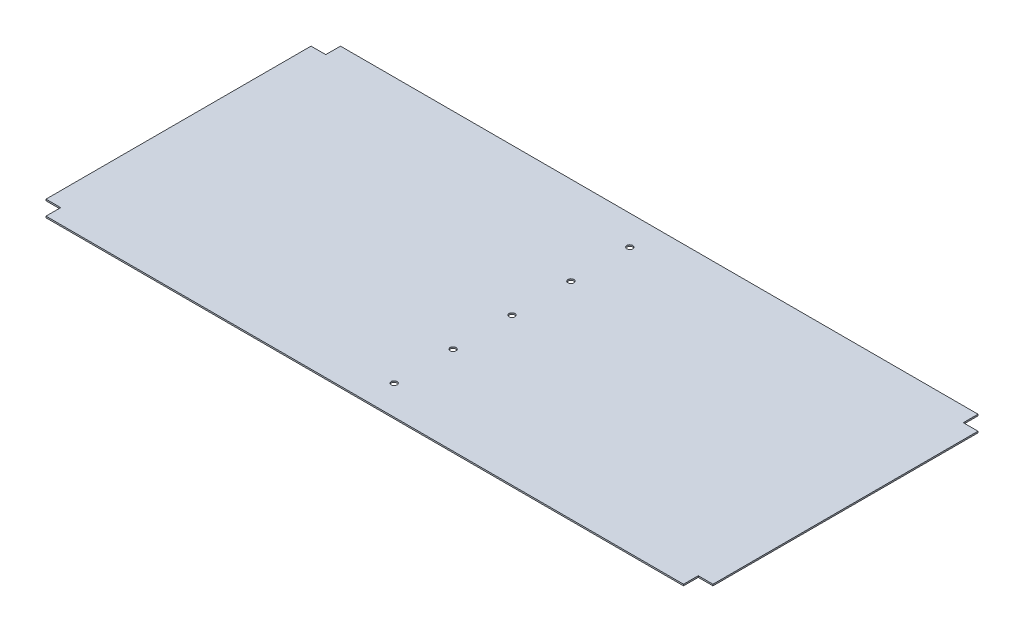
ISO-10303-21;
HEADER;
FILE_DESCRIPTION(('STEP AP214'),'2;1');
FILE_NAME('part.step','',(''),(''),'','','');
FILE_SCHEMA(('AUTOMOTIVE_DESIGN { 1 0 10303 214 1 1 1 1 }'));
ENDSEC;
DATA;
#1=APPLICATION_CONTEXT('core data for automotive mechanical design processes');
#2=APPLICATION_PROTOCOL_DEFINITION('international standard','automotive_design',2000,#1);
#3=PRODUCT_CONTEXT('',#1,'mechanical');
#4=PRODUCT('Part','Part','',(#3));
#5=PRODUCT_RELATED_PRODUCT_CATEGORY('part','',(#4));
#6=PRODUCT_DEFINITION_FORMATION('','',#4);
#7=PRODUCT_DEFINITION_CONTEXT('part definition',#1,'design');
#8=PRODUCT_DEFINITION('design','',#6,#7);
#9=PRODUCT_DEFINITION_SHAPE('','',#8);
#10=(LENGTH_UNIT() NAMED_UNIT(*) SI_UNIT(.MILLI.,.METRE.));
#11=(NAMED_UNIT(*) PLANE_ANGLE_UNIT() SI_UNIT($,.RADIAN.));
#12=(NAMED_UNIT(*) SI_UNIT($,.STERADIAN.) SOLID_ANGLE_UNIT());
#13=UNCERTAINTY_MEASURE_WITH_UNIT(LENGTH_MEASURE(1.E-05),#10,'distance_accuracy_value','');
#14=(GEOMETRIC_REPRESENTATION_CONTEXT(3) GLOBAL_UNCERTAINTY_ASSIGNED_CONTEXT((#13)) GLOBAL_UNIT_ASSIGNED_CONTEXT((#10,
#11,#12)) REPRESENTATION_CONTEXT('',''));
#15=CARTESIAN_POINT('',(0.,0.,0.));
#16=DIRECTION('',(0.,0.,1.));
#17=DIRECTION('',(1.,0.,0.));
#18=AXIS2_PLACEMENT_3D('',#15,#16,#17);
#19=CARTESIAN_POINT('',(-453.,-2.,0.));
#20=DIRECTION('',(-1.,0.,0.));
#21=DIRECTION('',(0.,0.,1.));
#22=AXIS2_PLACEMENT_3D('',#19,#20,#21);
#23=PLANE('',#22);
#24=DIRECTION('',(0.,1.,0.));
#25=VECTOR('',#24,1.);
#26=CARTESIAN_POINT('',(-453.,-10.,-20.));
#27=LINE('',#26,#25);
#28=CARTESIAN_POINT('',(-453.,-2.,-20.));
#29=VERTEX_POINT('',#28);
#30=CARTESIAN_POINT('',(-453.,0.,-20.));
#31=VERTEX_POINT('',#30);
#32=EDGE_CURVE('E139',#29,#31,#27,.T.);
#33=ORIENTED_EDGE('',*,*,#32,.T.);
#34=DIRECTION('',(0.,0.,1.));
#35=VECTOR('',#34,1.);
#36=CARTESIAN_POINT('',(-453.,0.,0.));
#37=LINE('',#36,#35);
#38=CARTESIAN_POINT('',(-453.,0.,-380.));
#39=VERTEX_POINT('',#38);
#40=EDGE_CURVE('E156',#39,#31,#37,.T.);
#41=ORIENTED_EDGE('',*,*,#40,.F.);
#42=DIRECTION('',(0.,1.,0.));
#43=VECTOR('',#42,1.);
#44=CARTESIAN_POINT('',(-453.,-10.,-380.));
#45=LINE('',#44,#43);
#46=CARTESIAN_POINT('',(-453.,-2.,-380.));
#47=VERTEX_POINT('',#46);
#48=EDGE_CURVE('E187',#47,#39,#45,.T.);
#49=ORIENTED_EDGE('',*,*,#48,.F.);
#50=DIRECTION('',(0.,0.,1.));
#51=VECTOR('',#50,1.);
#52=CARTESIAN_POINT('',(-453.,-2.,0.));
#53=LINE('',#52,#51);
#54=EDGE_CURVE('E209',#47,#29,#53,.T.);
#55=ORIENTED_EDGE('',*,*,#54,.T.);
#56=EDGE_LOOP('',(#33,#41,#49,#55));
#57=FACE_BOUND('',#56,.T.);
#58=ADVANCED_FACE('F38',(#57),#23,.T.);
#59=CARTESIAN_POINT('',(-453.,-2.,-400.));
#60=DIRECTION('',(0.,0.,-1.));
#61=DIRECTION('',(-1.,0.,0.));
#62=AXIS2_PLACEMENT_3D('',#59,#60,#61);
#63=PLANE('',#62);
#64=DIRECTION('',(0.,1.,0.));
#65=VECTOR('',#64,1.);
#66=CARTESIAN_POINT('',(433.,-10.,-400.));
#67=LINE('',#66,#65);
#68=CARTESIAN_POINT('',(433.,-2.,-400.));
#69=VERTEX_POINT('',#68);
#70=CARTESIAN_POINT('',(433.,0.,-400.));
#71=VERTEX_POINT('',#70);
#72=EDGE_CURVE('E54',#69,#71,#67,.T.);
#73=ORIENTED_EDGE('',*,*,#72,.F.);
#74=DIRECTION('',(-1.,0.,0.));
#75=VECTOR('',#74,1.);
#76=CARTESIAN_POINT('',(-453.,-2.,-400.));
#77=LINE('',#76,#75);
#78=CARTESIAN_POINT('',(-433.,-2.,-400.));
#79=VERTEX_POINT('',#78);
#80=EDGE_CURVE('E11',#69,#79,#77,.T.);
#81=ORIENTED_EDGE('',*,*,#80,.T.);
#82=DIRECTION('',(0.,1.,0.));
#83=VECTOR('',#82,1.);
#84=CARTESIAN_POINT('',(-433.,-10.,-400.));
#85=LINE('',#84,#83);
#86=CARTESIAN_POINT('',(-433.,0.,-400.));
#87=VERTEX_POINT('',#86);
#88=EDGE_CURVE('E188',#79,#87,#85,.T.);
#89=ORIENTED_EDGE('',*,*,#88,.T.);
#90=DIRECTION('',(-1.,0.,0.));
#91=VECTOR('',#90,1.);
#92=CARTESIAN_POINT('',(-453.,0.,-400.));
#93=LINE('',#92,#91);
#94=EDGE_CURVE('E41',#71,#87,#93,.T.);
#95=ORIENTED_EDGE('',*,*,#94,.F.);
#96=EDGE_LOOP('',(#73,#81,#89,#95));
#97=FACE_BOUND('',#96,.T.);
#98=ADVANCED_FACE('F226',(#97),#63,.T.);
#99=CARTESIAN_POINT('',(453.,-2.,-1.72915724161782E-13));
#100=DIRECTION('',(1.,0.,0.));
#101=DIRECTION('',(0.,0.,-1.));
#102=AXIS2_PLACEMENT_3D('',#99,#100,#101);
#103=PLANE('',#102);
#104=DIRECTION('',(0.,1.,0.));
#105=VECTOR('',#104,1.);
#106=CARTESIAN_POINT('',(453.,-10.,-380.));
#107=LINE('',#106,#105);
#108=CARTESIAN_POINT('',(453.,-2.,-380.));
#109=VERTEX_POINT('',#108);
#110=CARTESIAN_POINT('',(453.,0.,-380.));
#111=VERTEX_POINT('',#110);
#112=EDGE_CURVE('E166',#109,#111,#107,.T.);
#113=ORIENTED_EDGE('',*,*,#112,.T.);
#114=DIRECTION('',(0.,0.,-1.));
#115=VECTOR('',#114,1.);
#116=CARTESIAN_POINT('',(453.,0.,-1.72915724161782E-13));
#117=LINE('',#116,#115);
#118=CARTESIAN_POINT('',(453.,0.,-19.9999999999999));
#119=VERTEX_POINT('',#118);
#120=EDGE_CURVE('E219',#119,#111,#117,.T.);
#121=ORIENTED_EDGE('',*,*,#120,.F.);
#122=DIRECTION('',(0.,1.,0.));
#123=VECTOR('',#122,1.);
#124=CARTESIAN_POINT('',(453.,-10.,-19.9999999999999));
#125=LINE('',#124,#123);
#126=CARTESIAN_POINT('',(453.,-2.,-19.9999999999999));
#127=VERTEX_POINT('',#126);
#128=EDGE_CURVE('E62',#127,#119,#125,.T.);
#129=ORIENTED_EDGE('',*,*,#128,.F.);
#130=DIRECTION('',(0.,0.,-1.));
#131=VECTOR('',#130,1.);
#132=CARTESIAN_POINT('',(453.,-2.,-1.72915724161782E-13));
#133=LINE('',#132,#131);
#134=EDGE_CURVE('E46',#127,#109,#133,.T.);
#135=ORIENTED_EDGE('',*,*,#134,.T.);
#136=EDGE_LOOP('',(#113,#121,#129,#135));
#137=FACE_BOUND('',#136,.T.);
#138=ADVANCED_FACE('F267',(#137),#103,.T.);
#139=CARTESIAN_POINT('',(-453.,-2.,0.));
#140=DIRECTION('',(0.,0.,1.));
#141=DIRECTION('',(1.,0.,0.));
#142=AXIS2_PLACEMENT_3D('',#139,#140,#141);
#143=PLANE('',#142);
#144=DIRECTION('',(0.,1.,0.));
#145=VECTOR('',#144,1.);
#146=CARTESIAN_POINT('',(433.,-10.,0.));
#147=LINE('',#146,#145);
#148=CARTESIAN_POINT('',(433.,-2.,0.));
#149=VERTEX_POINT('',#148);
#150=CARTESIAN_POINT('',(433.,0.,0.));
#151=VERTEX_POINT('',#150);
#152=EDGE_CURVE('E149',#149,#151,#147,.T.);
#153=ORIENTED_EDGE('',*,*,#152,.T.);
#154=DIRECTION('',(1.,0.,0.));
#155=VECTOR('',#154,1.);
#156=CARTESIAN_POINT('',(-453.,0.,0.));
#157=LINE('',#156,#155);
#158=CARTESIAN_POINT('',(-433.,0.,0.));
#159=VERTEX_POINT('',#158);
#160=EDGE_CURVE('E218',#159,#151,#157,.T.);
#161=ORIENTED_EDGE('',*,*,#160,.F.);
#162=DIRECTION('',(0.,1.,0.));
#163=VECTOR('',#162,1.);
#164=CARTESIAN_POINT('',(-433.,-10.,1.11022302462516E-13));
#165=LINE('',#164,#163);
#166=CARTESIAN_POINT('',(-433.,-2.,1.11022302462516E-13));
#167=VERTEX_POINT('',#166);
#168=EDGE_CURVE('E140',#167,#159,#165,.T.);
#169=ORIENTED_EDGE('',*,*,#168,.F.);
#170=DIRECTION('',(1.,0.,0.));
#171=VECTOR('',#170,1.);
#172=CARTESIAN_POINT('',(-453.,-2.,0.));
#173=LINE('',#172,#171);
#174=EDGE_CURVE('E212',#167,#149,#173,.T.);
#175=ORIENTED_EDGE('',*,*,#174,.T.);
#176=EDGE_LOOP('',(#153,#161,#169,#175));
#177=FACE_BOUND('',#176,.T.);
#178=ADVANCED_FACE('F245',(#177),#143,.T.);
#179=CARTESIAN_POINT('',(0.,-2.,0.));
#180=DIRECTION('',(0.,-1.,0.));
#181=DIRECTION('',(0.,0.,-1.));
#182=AXIS2_PLACEMENT_3D('',#179,#180,#181);
#183=PLANE('',#182);
#184=CARTESIAN_POINT('',(0.,-2.,-360.));
#185=DIRECTION('',(0.,-1.,0.));
#186=DIRECTION('',(0.,0.,-1.));
#187=AXIS2_PLACEMENT_3D('',#184,#185,#186);
#188=CIRCLE('',#187,4.);
#189=CARTESIAN_POINT('',(0.,-2.,-364.));
#190=VERTEX_POINT('',#189);
#191=EDGE_CURVE('E176',#190,#190,#188,.T.);
#192=ORIENTED_EDGE('',*,*,#191,.F.);
#193=EDGE_LOOP('',(#192));
#194=FACE_BOUND('',#193,.T.);
#195=CARTESIAN_POINT('',(0.,-2.,-280.));
#196=DIRECTION('',(0.,-1.,0.));
#197=DIRECTION('',(0.,0.,-1.));
#198=AXIS2_PLACEMENT_3D('',#195,#196,#197);
#199=CIRCLE('',#198,4.);
#200=CARTESIAN_POINT('',(0.,-2.,-284.));
#201=VERTEX_POINT('',#200);
#202=EDGE_CURVE('E421',#201,#201,#199,.T.);
#203=ORIENTED_EDGE('',*,*,#202,.F.);
#204=EDGE_LOOP('',(#203));
#205=FACE_BOUND('',#204,.T.);
#206=CARTESIAN_POINT('',(0.,-2.,-200.));
#207=DIRECTION('',(0.,-1.,0.));
#208=DIRECTION('',(0.,0.,-1.));
#209=AXIS2_PLACEMENT_3D('',#206,#207,#208);
#210=CIRCLE('',#209,4.);
#211=CARTESIAN_POINT('',(0.,-2.,-204.));
#212=VERTEX_POINT('',#211);
#213=EDGE_CURVE('E418',#212,#212,#210,.T.);
#214=ORIENTED_EDGE('',*,*,#213,.F.);
#215=EDGE_LOOP('',(#214));
#216=FACE_BOUND('',#215,.T.);
#217=CARTESIAN_POINT('',(0.,-2.,-120.));
#218=DIRECTION('',(0.,-1.,0.));
#219=DIRECTION('',(0.,0.,-1.));
#220=AXIS2_PLACEMENT_3D('',#217,#218,#219);
#221=CIRCLE('',#220,4.);
#222=CARTESIAN_POINT('',(0.,-2.,-124.));
#223=VERTEX_POINT('',#222);
#224=EDGE_CURVE('E402',#223,#223,#221,.T.);
#225=ORIENTED_EDGE('',*,*,#224,.F.);
#226=EDGE_LOOP('',(#225));
#227=FACE_BOUND('',#226,.T.);
#228=CARTESIAN_POINT('',(0.,-2.,-40.0000000000002));
#229=DIRECTION('',(0.,-1.,0.));
#230=DIRECTION('',(0.,0.,-1.));
#231=AXIS2_PLACEMENT_3D('',#228,#229,#230);
#232=CIRCLE('',#231,4.);
#233=CARTESIAN_POINT('',(0.,-2.,-44.0000000000002));
#234=VERTEX_POINT('',#233);
#235=EDGE_CURVE('E399',#234,#234,#232,.T.);
#236=ORIENTED_EDGE('',*,*,#235,.F.);
#237=EDGE_LOOP('',(#236));
#238=FACE_BOUND('',#237,.T.);
#239=DIRECTION('',(-1.,0.,0.));
#240=VECTOR('',#239,1.);
#241=CARTESIAN_POINT('',(0.,-2.,-380.));
#242=LINE('',#241,#240);
#243=CARTESIAN_POINT('',(433.,-2.,-380.));
#244=VERTEX_POINT('',#243);
#245=EDGE_CURVE('E207',#109,#244,#242,.T.);
#246=ORIENTED_EDGE('',*,*,#245,.F.);
#247=ORIENTED_EDGE('',*,*,#134,.F.);
#248=DIRECTION('',(1.,0.,0.));
#249=VECTOR('',#248,1.);
#250=CARTESIAN_POINT('',(0.,-2.,-19.9999999999999));
#251=LINE('',#250,#249);
#252=CARTESIAN_POINT('',(433.,-2.,-19.9999999999999));
#253=VERTEX_POINT('',#252);
#254=EDGE_CURVE('E201',#253,#127,#251,.T.);
#255=ORIENTED_EDGE('',*,*,#254,.F.);
#256=DIRECTION('',(0.,0.,-1.));
#257=VECTOR('',#256,1.);
#258=CARTESIAN_POINT('',(433.,-2.,-2.40363284831348E-12));
#259=LINE('',#258,#257);
#260=EDGE_CURVE('E203',#149,#253,#259,.T.);
#261=ORIENTED_EDGE('',*,*,#260,.F.);
#262=ORIENTED_EDGE('',*,*,#174,.F.);
#263=DIRECTION('',(0.,0.,1.));
#264=VECTOR('',#263,1.);
#265=CARTESIAN_POINT('',(-433.,-2.,0.));
#266=LINE('',#265,#264);
#267=CARTESIAN_POINT('',(-433.,-2.,-20.));
#268=VERTEX_POINT('',#267);
#269=EDGE_CURVE('E198',#268,#167,#266,.T.);
#270=ORIENTED_EDGE('',*,*,#269,.F.);
#271=DIRECTION('',(1.,0.,0.));
#272=VECTOR('',#271,1.);
#273=CARTESIAN_POINT('',(0.,-2.,-20.));
#274=LINE('',#273,#272);
#275=EDGE_CURVE('E136',#29,#268,#274,.T.);
#276=ORIENTED_EDGE('',*,*,#275,.F.);
#277=ORIENTED_EDGE('',*,*,#54,.F.);
#278=DIRECTION('',(-1.,0.,0.));
#279=VECTOR('',#278,1.);
#280=CARTESIAN_POINT('',(0.,-2.,-380.));
#281=LINE('',#280,#279);
#282=CARTESIAN_POINT('',(-433.,-2.,-380.));
#283=VERTEX_POINT('',#282);
#284=EDGE_CURVE('E191',#283,#47,#281,.T.);
#285=ORIENTED_EDGE('',*,*,#284,.F.);
#286=DIRECTION('',(0.,0.,1.));
#287=VECTOR('',#286,1.);
#288=CARTESIAN_POINT('',(-433.,-2.,0.));
#289=LINE('',#288,#287);
#290=EDGE_CURVE('E196',#79,#283,#289,.T.);
#291=ORIENTED_EDGE('',*,*,#290,.F.);
#292=ORIENTED_EDGE('',*,*,#80,.F.);
#293=DIRECTION('',(0.,0.,-1.));
#294=VECTOR('',#293,1.);
#295=CARTESIAN_POINT('',(432.999999999998,-2.,2.40363284831346E-12));
#296=LINE('',#295,#294);
#297=EDGE_CURVE('E205',#244,#69,#296,.T.);
#298=ORIENTED_EDGE('',*,*,#297,.F.);
#299=EDGE_LOOP('',(#246,#247,#255,#261,#262,#270,#276,#277,#285,#291,#292,#298));
#300=FACE_BOUND('',#299,.T.);
#301=ADVANCED_FACE('F235',(#194,#205,#216,#227,#238,#300),#183,.T.);
#302=CARTESIAN_POINT('',(0.,0.,0.));
#303=DIRECTION('',(0.,-1.,0.));
#304=DIRECTION('',(0.,0.,-1.));
#305=AXIS2_PLACEMENT_3D('',#302,#303,#304);
#306=PLANE('',#305);
#307=CARTESIAN_POINT('',(0.,0.,-360.));
#308=DIRECTION('',(0.,1.,0.));
#309=DIRECTION('',(0.,0.,1.));
#310=AXIS2_PLACEMENT_3D('',#307,#308,#309);
#311=CIRCLE('',#310,4.);
#312=CARTESIAN_POINT('',(0.,0.,-356.));
#313=VERTEX_POINT('',#312);
#314=EDGE_CURVE('E398',#313,#313,#311,.T.);
#315=ORIENTED_EDGE('',*,*,#314,.F.);
#316=EDGE_LOOP('',(#315));
#317=FACE_BOUND('',#316,.T.);
#318=CARTESIAN_POINT('',(0.,0.,-280.));
#319=DIRECTION('',(0.,1.,0.));
#320=DIRECTION('',(0.,0.,1.));
#321=AXIS2_PLACEMENT_3D('',#318,#319,#320);
#322=CIRCLE('',#321,4.);
#323=CARTESIAN_POINT('',(0.,0.,-276.));
#324=VERTEX_POINT('',#323);
#325=EDGE_CURVE('E400',#324,#324,#322,.T.);
#326=ORIENTED_EDGE('',*,*,#325,.F.);
#327=EDGE_LOOP('',(#326));
#328=FACE_BOUND('',#327,.T.);
#329=CARTESIAN_POINT('',(0.,0.,-200.));
#330=DIRECTION('',(0.,1.,0.));
#331=DIRECTION('',(0.,0.,1.));
#332=AXIS2_PLACEMENT_3D('',#329,#330,#331);
#333=CIRCLE('',#332,4.);
#334=CARTESIAN_POINT('',(0.,0.,-196.));
#335=VERTEX_POINT('',#334);
#336=EDGE_CURVE('E405',#335,#335,#333,.T.);
#337=ORIENTED_EDGE('',*,*,#336,.F.);
#338=EDGE_LOOP('',(#337));
#339=FACE_BOUND('',#338,.T.);
#340=CARTESIAN_POINT('',(0.,0.,-120.));
#341=DIRECTION('',(0.,1.,0.));
#342=DIRECTION('',(0.,0.,1.));
#343=AXIS2_PLACEMENT_3D('',#340,#341,#342);
#344=CIRCLE('',#343,4.);
#345=CARTESIAN_POINT('',(0.,0.,-116.));
#346=VERTEX_POINT('',#345);
#347=EDGE_CURVE('E410',#346,#346,#344,.T.);
#348=ORIENTED_EDGE('',*,*,#347,.F.);
#349=EDGE_LOOP('',(#348));
#350=FACE_BOUND('',#349,.T.);
#351=CARTESIAN_POINT('',(0.,0.,-40.0000000000002));
#352=DIRECTION('',(0.,1.,0.));
#353=DIRECTION('',(0.,0.,1.));
#354=AXIS2_PLACEMENT_3D('',#351,#352,#353);
#355=CIRCLE('',#354,4.);
#356=CARTESIAN_POINT('',(0.,0.,-36.0000000000002));
#357=VERTEX_POINT('',#356);
#358=EDGE_CURVE('E413',#357,#357,#355,.T.);
#359=ORIENTED_EDGE('',*,*,#358,.F.);
#360=EDGE_LOOP('',(#359));
#361=FACE_BOUND('',#360,.T.);
#362=ORIENTED_EDGE('',*,*,#120,.T.);
#363=DIRECTION('',(1.,0.,0.));
#364=VECTOR('',#363,1.);
#365=CARTESIAN_POINT('',(453.,0.,-380.));
#366=LINE('',#365,#364);
#367=CARTESIAN_POINT('',(433.,0.,-380.));
#368=VERTEX_POINT('',#367);
#369=EDGE_CURVE('E175',#368,#111,#366,.T.);
#370=ORIENTED_EDGE('',*,*,#369,.F.);
#371=DIRECTION('',(0.,0.,1.));
#372=VECTOR('',#371,1.);
#373=CARTESIAN_POINT('',(433.,0.,-400.));
#374=LINE('',#373,#372);
#375=EDGE_CURVE('E173',#71,#368,#374,.T.);
#376=ORIENTED_EDGE('',*,*,#375,.F.);
#377=ORIENTED_EDGE('',*,*,#94,.T.);
#378=DIRECTION('',(0.,0.,-1.));
#379=VECTOR('',#378,1.);
#380=CARTESIAN_POINT('',(-433.,0.,-400.));
#381=LINE('',#380,#379);
#382=CARTESIAN_POINT('',(-433.,0.,-380.));
#383=VERTEX_POINT('',#382);
#384=EDGE_CURVE('E185',#383,#87,#381,.T.);
#385=ORIENTED_EDGE('',*,*,#384,.F.);
#386=DIRECTION('',(1.,0.,0.));
#387=VECTOR('',#386,1.);
#388=CARTESIAN_POINT('',(-453.,0.,-380.));
#389=LINE('',#388,#387);
#390=EDGE_CURVE('E161',#39,#383,#389,.T.);
#391=ORIENTED_EDGE('',*,*,#390,.F.);
#392=ORIENTED_EDGE('',*,*,#40,.T.);
#393=DIRECTION('',(-1.,0.,0.));
#394=VECTOR('',#393,1.);
#395=CARTESIAN_POINT('',(-453.,0.,-20.));
#396=LINE('',#395,#394);
#397=CARTESIAN_POINT('',(-433.,0.,-20.));
#398=VERTEX_POINT('',#397);
#399=EDGE_CURVE('E133',#398,#31,#396,.T.);
#400=ORIENTED_EDGE('',*,*,#399,.F.);
#401=DIRECTION('',(0.,0.,-1.));
#402=VECTOR('',#401,1.);
#403=CARTESIAN_POINT('',(-433.,0.,1.11022302462516E-13));
#404=LINE('',#403,#402);
#405=EDGE_CURVE('E143',#159,#398,#404,.T.);
#406=ORIENTED_EDGE('',*,*,#405,.F.);
#407=ORIENTED_EDGE('',*,*,#160,.T.);
#408=DIRECTION('',(0.,0.,1.));
#409=VECTOR('',#408,1.);
#410=CARTESIAN_POINT('',(433.,0.,0.));
#411=LINE('',#410,#409);
#412=CARTESIAN_POINT('',(433.,0.,-19.9999999999999));
#413=VERTEX_POINT('',#412);
#414=EDGE_CURVE('E165',#413,#151,#411,.T.);
#415=ORIENTED_EDGE('',*,*,#414,.F.);
#416=DIRECTION('',(-1.,0.,0.));
#417=VECTOR('',#416,1.);
#418=CARTESIAN_POINT('',(453.,0.,-19.9999999999999));
#419=LINE('',#418,#417);
#420=EDGE_CURVE('E163',#119,#413,#419,.T.);
#421=ORIENTED_EDGE('',*,*,#420,.F.);
#422=EDGE_LOOP('',(#362,#370,#376,#377,#385,#391,#392,#400,#406,#407,#415,#421));
#423=FACE_BOUND('',#422,.T.);
#424=ADVANCED_FACE('F153',(#317,#328,#339,#350,#361,#423),#306,.F.);
#425=CARTESIAN_POINT('',(-433.,-10.,-400.));
#426=DIRECTION('',(1.,0.,0.));
#427=DIRECTION('',(0.,0.,-1.));
#428=AXIS2_PLACEMENT_3D('',#425,#426,#427);
#429=PLANE('',#428);
#430=ORIENTED_EDGE('',*,*,#290,.T.);
#431=DIRECTION('',(0.,1.,0.));
#432=VECTOR('',#431,1.);
#433=CARTESIAN_POINT('',(-433.,-10.,-380.));
#434=LINE('',#433,#432);
#435=EDGE_CURVE('E192',#283,#383,#434,.T.);
#436=ORIENTED_EDGE('',*,*,#435,.T.);
#437=ORIENTED_EDGE('',*,*,#384,.T.);
#438=ORIENTED_EDGE('',*,*,#88,.F.);
#439=EDGE_LOOP('',(#430,#436,#437,#438));
#440=FACE_BOUND('',#439,.T.);
#441=ADVANCED_FACE('F230',(#440),#429,.F.);
#442=CARTESIAN_POINT('',(-453.,-10.,-380.));
#443=DIRECTION('',(0.,0.,1.));
#444=DIRECTION('',(1.,0.,0.));
#445=AXIS2_PLACEMENT_3D('',#442,#443,#444);
#446=PLANE('',#445);
#447=ORIENTED_EDGE('',*,*,#284,.T.);
#448=ORIENTED_EDGE('',*,*,#48,.T.);
#449=ORIENTED_EDGE('',*,*,#390,.T.);
#450=ORIENTED_EDGE('',*,*,#435,.F.);
#451=EDGE_LOOP('',(#447,#448,#449,#450));
#452=FACE_BOUND('',#451,.T.);
#453=ADVANCED_FACE('F240',(#452),#446,.F.);
#454=CARTESIAN_POINT('',(-453.,-10.,-20.));
#455=DIRECTION('',(0.,0.,-1.));
#456=DIRECTION('',(-1.,0.,0.));
#457=AXIS2_PLACEMENT_3D('',#454,#455,#456);
#458=PLANE('',#457);
#459=ORIENTED_EDGE('',*,*,#275,.T.);
#460=DIRECTION('',(0.,1.,0.));
#461=VECTOR('',#460,1.);
#462=CARTESIAN_POINT('',(-433.,-10.,-20.));
#463=LINE('',#462,#461);
#464=EDGE_CURVE('E129',#268,#398,#463,.T.);
#465=ORIENTED_EDGE('',*,*,#464,.T.);
#466=ORIENTED_EDGE('',*,*,#399,.T.);
#467=ORIENTED_EDGE('',*,*,#32,.F.);
#468=EDGE_LOOP('',(#459,#465,#466,#467));
#469=FACE_BOUND('',#468,.T.);
#470=ADVANCED_FACE('F131',(#469),#458,.F.);
#471=CARTESIAN_POINT('',(-433.,-10.,1.11022302462516E-13));
#472=DIRECTION('',(1.,0.,0.));
#473=DIRECTION('',(0.,0.,-1.));
#474=AXIS2_PLACEMENT_3D('',#471,#472,#473);
#475=PLANE('',#474);
#476=ORIENTED_EDGE('',*,*,#269,.T.);
#477=ORIENTED_EDGE('',*,*,#168,.T.);
#478=ORIENTED_EDGE('',*,*,#405,.T.);
#479=ORIENTED_EDGE('',*,*,#464,.F.);
#480=EDGE_LOOP('',(#476,#477,#478,#479));
#481=FACE_BOUND('',#480,.T.);
#482=ADVANCED_FACE('F144',(#481),#475,.F.);
#483=CARTESIAN_POINT('',(433.,-10.,0.));
#484=DIRECTION('',(-1.,0.,0.));
#485=DIRECTION('',(0.,0.,1.));
#486=AXIS2_PLACEMENT_3D('',#483,#484,#485);
#487=PLANE('',#486);
#488=ORIENTED_EDGE('',*,*,#260,.T.);
#489=DIRECTION('',(0.,1.,0.));
#490=VECTOR('',#489,1.);
#491=CARTESIAN_POINT('',(433.,-10.,-19.9999999999999));
#492=LINE('',#491,#490);
#493=EDGE_CURVE('E170',#253,#413,#492,.T.);
#494=ORIENTED_EDGE('',*,*,#493,.T.);
#495=ORIENTED_EDGE('',*,*,#414,.T.);
#496=ORIENTED_EDGE('',*,*,#152,.F.);
#497=EDGE_LOOP('',(#488,#494,#495,#496));
#498=FACE_BOUND('',#497,.T.);
#499=ADVANCED_FACE('F248',(#498),#487,.F.);
#500=CARTESIAN_POINT('',(453.,-10.,-19.9999999999999));
#501=DIRECTION('',(0.,0.,-1.));
#502=DIRECTION('',(-1.,0.,0.));
#503=AXIS2_PLACEMENT_3D('',#500,#501,#502);
#504=PLANE('',#503);
#505=ORIENTED_EDGE('',*,*,#254,.T.);
#506=ORIENTED_EDGE('',*,*,#128,.T.);
#507=ORIENTED_EDGE('',*,*,#420,.T.);
#508=ORIENTED_EDGE('',*,*,#493,.F.);
#509=EDGE_LOOP('',(#505,#506,#507,#508));
#510=FACE_BOUND('',#509,.T.);
#511=ADVANCED_FACE('F251',(#510),#504,.F.);
#512=CARTESIAN_POINT('',(453.,-10.,-380.));
#513=DIRECTION('',(0.,0.,1.));
#514=DIRECTION('',(1.,0.,0.));
#515=AXIS2_PLACEMENT_3D('',#512,#513,#514);
#516=PLANE('',#515);
#517=ORIENTED_EDGE('',*,*,#245,.T.);
#518=DIRECTION('',(0.,1.,0.));
#519=VECTOR('',#518,1.);
#520=CARTESIAN_POINT('',(433.,-10.,-380.));
#521=LINE('',#520,#519);
#522=EDGE_CURVE('E180',#244,#368,#521,.T.);
#523=ORIENTED_EDGE('',*,*,#522,.T.);
#524=ORIENTED_EDGE('',*,*,#369,.T.);
#525=ORIENTED_EDGE('',*,*,#112,.F.);
#526=EDGE_LOOP('',(#517,#523,#524,#525));
#527=FACE_BOUND('',#526,.T.);
#528=ADVANCED_FACE('F253',(#527),#516,.F.);
#529=CARTESIAN_POINT('',(433.,-10.,-400.));
#530=DIRECTION('',(-1.,0.,0.));
#531=DIRECTION('',(0.,0.,1.));
#532=AXIS2_PLACEMENT_3D('',#529,#530,#531);
#533=PLANE('',#532);
#534=ORIENTED_EDGE('',*,*,#297,.T.);
#535=ORIENTED_EDGE('',*,*,#72,.T.);
#536=ORIENTED_EDGE('',*,*,#375,.T.);
#537=ORIENTED_EDGE('',*,*,#522,.F.);
#538=EDGE_LOOP('',(#534,#535,#536,#537));
#539=FACE_BOUND('',#538,.T.);
#540=ADVANCED_FACE('F259',(#539),#533,.F.);
#541=CARTESIAN_POINT('',(0.,-10.,-40.0000000000002));
#542=DIRECTION('',(0.,1.,0.));
#543=DIRECTION('',(0.,0.,1.));
#544=AXIS2_PLACEMENT_3D('',#541,#542,#543);
#545=CYLINDRICAL_SURFACE('',#544,4.);
#546=ORIENTED_EDGE('',*,*,#235,.T.);
#547=EDGE_LOOP('',(#546));
#548=FACE_BOUND('',#547,.T.);
#549=ORIENTED_EDGE('',*,*,#358,.T.);
#550=EDGE_LOOP('',(#549));
#551=FACE_BOUND('',#550,.T.);
#552=ADVANCED_FACE('F294',(#548,#551),#545,.F.);
#553=CARTESIAN_POINT('',(0.,-10.,-120.));
#554=DIRECTION('',(0.,1.,0.));
#555=DIRECTION('',(0.,0.,1.));
#556=AXIS2_PLACEMENT_3D('',#553,#554,#555);
#557=CYLINDRICAL_SURFACE('',#556,4.);
#558=ORIENTED_EDGE('',*,*,#224,.T.);
#559=EDGE_LOOP('',(#558));
#560=FACE_BOUND('',#559,.T.);
#561=ORIENTED_EDGE('',*,*,#347,.T.);
#562=EDGE_LOOP('',(#561));
#563=FACE_BOUND('',#562,.T.);
#564=ADVANCED_FACE('F297',(#560,#563),#557,.F.);
#565=CARTESIAN_POINT('',(0.,-10.,-200.));
#566=DIRECTION('',(0.,1.,0.));
#567=DIRECTION('',(0.,0.,1.));
#568=AXIS2_PLACEMENT_3D('',#565,#566,#567);
#569=CYLINDRICAL_SURFACE('',#568,4.);
#570=ORIENTED_EDGE('',*,*,#213,.T.);
#571=EDGE_LOOP('',(#570));
#572=FACE_BOUND('',#571,.T.);
#573=ORIENTED_EDGE('',*,*,#336,.T.);
#574=EDGE_LOOP('',(#573));
#575=FACE_BOUND('',#574,.T.);
#576=ADVANCED_FACE('F305',(#572,#575),#569,.F.);
#577=CARTESIAN_POINT('',(0.,-10.,-280.));
#578=DIRECTION('',(0.,1.,0.));
#579=DIRECTION('',(0.,0.,1.));
#580=AXIS2_PLACEMENT_3D('',#577,#578,#579);
#581=CYLINDRICAL_SURFACE('',#580,4.);
#582=ORIENTED_EDGE('',*,*,#202,.T.);
#583=EDGE_LOOP('',(#582));
#584=FACE_BOUND('',#583,.T.);
#585=ORIENTED_EDGE('',*,*,#325,.T.);
#586=EDGE_LOOP('',(#585));
#587=FACE_BOUND('',#586,.T.);
#588=ADVANCED_FACE('F366',(#584,#587),#581,.F.);
#589=CARTESIAN_POINT('',(0.,-10.,-360.));
#590=DIRECTION('',(0.,1.,0.));
#591=DIRECTION('',(0.,0.,1.));
#592=AXIS2_PLACEMENT_3D('',#589,#590,#591);
#593=CYLINDRICAL_SURFACE('',#592,4.);
#594=ORIENTED_EDGE('',*,*,#191,.T.);
#595=EDGE_LOOP('',(#594));
#596=FACE_BOUND('',#595,.T.);
#597=ORIENTED_EDGE('',*,*,#314,.T.);
#598=EDGE_LOOP('',(#597));
#599=FACE_BOUND('',#598,.T.);
#600=ADVANCED_FACE('F376',(#596,#599),#593,.F.);
#601=CLOSED_SHELL('',(#58,#98,#138,#178,#301,#424,#441,#453,#470,#482,#499,#511,#528,#540,#552,
#564,#576,#588,#600));
#602=MANIFOLD_SOLID_BREP('B2',#601);
#603=ADVANCED_BREP_SHAPE_REPRESENTATION('',(#18,#602),#14);
#604=SHAPE_DEFINITION_REPRESENTATION(#9,#603);
ENDSEC;
END-ISO-10303-21;
